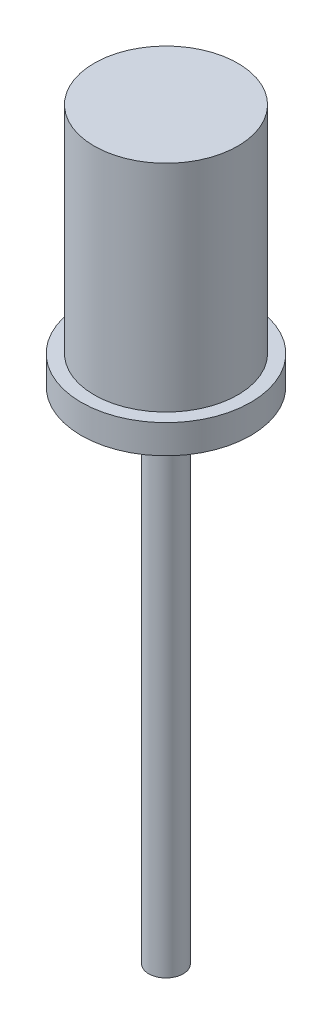
ISO-10303-21;
HEADER;
FILE_DESCRIPTION(('STEP AP214'),'2;1');
FILE_NAME('part.step','',(''),(''),'','','');
FILE_SCHEMA(('AUTOMOTIVE_DESIGN { 1 0 10303 214 1 1 1 1 }'));
ENDSEC;
DATA;
#1=APPLICATION_CONTEXT('core data for automotive mechanical design processes');
#2=APPLICATION_PROTOCOL_DEFINITION('international standard','automotive_design',2000,#1);
#3=PRODUCT_CONTEXT('',#1,'mechanical');
#4=PRODUCT('Part','Part','',(#3));
#5=PRODUCT_RELATED_PRODUCT_CATEGORY('part','',(#4));
#6=PRODUCT_DEFINITION_FORMATION('','',#4);
#7=PRODUCT_DEFINITION_CONTEXT('part definition',#1,'design');
#8=PRODUCT_DEFINITION('design','',#6,#7);
#9=PRODUCT_DEFINITION_SHAPE('','',#8);
#10=(LENGTH_UNIT() NAMED_UNIT(*) SI_UNIT(.MILLI.,.METRE.));
#11=(NAMED_UNIT(*) PLANE_ANGLE_UNIT() SI_UNIT($,.RADIAN.));
#12=(NAMED_UNIT(*) SI_UNIT($,.STERADIAN.) SOLID_ANGLE_UNIT());
#13=UNCERTAINTY_MEASURE_WITH_UNIT(LENGTH_MEASURE(1.E-05),#10,'distance_accuracy_value','');
#14=(GEOMETRIC_REPRESENTATION_CONTEXT(3) GLOBAL_UNCERTAINTY_ASSIGNED_CONTEXT((#13)) GLOBAL_UNIT_ASSIGNED_CONTEXT((#10,
#11,#12)) REPRESENTATION_CONTEXT('',''));
#15=CARTESIAN_POINT('',(0.,0.,0.));
#16=DIRECTION('',(0.,0.,1.));
#17=DIRECTION('',(1.,0.,0.));
#18=AXIS2_PLACEMENT_3D('',#15,#16,#17);
#19=CARTESIAN_POINT('',(0.,1.,0.));
#20=DIRECTION('',(0.,-1.,0.));
#21=DIRECTION('',(0.,0.,-1.));
#22=AXIS2_PLACEMENT_3D('',#19,#20,#21);
#23=CYLINDRICAL_SURFACE('',#22,2.95);
#24=CARTESIAN_POINT('',(0.,1.,0.));
#25=DIRECTION('',(0.,1.,0.));
#26=DIRECTION('',(0.,0.,1.));
#27=AXIS2_PLACEMENT_3D('',#24,#25,#26);
#28=CIRCLE('',#27,2.95);
#29=CARTESIAN_POINT('',(0.,1.,2.95));
#30=VERTEX_POINT('',#29);
#31=EDGE_CURVE('E51',#30,#30,#28,.T.);
#32=ORIENTED_EDGE('',*,*,#31,.F.);
#33=EDGE_LOOP('',(#32));
#34=FACE_BOUND('',#33,.T.);
#35=CARTESIAN_POINT('',(0.,0.,0.));
#36=DIRECTION('',(0.,1.,0.));
#37=DIRECTION('',(0.,0.,1.));
#38=AXIS2_PLACEMENT_3D('',#35,#36,#37);
#39=CIRCLE('',#38,2.95);
#40=CARTESIAN_POINT('',(0.,0.,2.95));
#41=VERTEX_POINT('',#40);
#42=EDGE_CURVE('E42',#41,#41,#39,.T.);
#43=ORIENTED_EDGE('',*,*,#42,.T.);
#44=EDGE_LOOP('',(#43));
#45=FACE_BOUND('',#44,.T.);
#46=ADVANCED_FACE('F39',(#34,#45),#23,.T.);
#47=CARTESIAN_POINT('',(0.,1.,0.));
#48=DIRECTION('',(0.,1.,0.));
#49=DIRECTION('',(0.,0.,1.));
#50=AXIS2_PLACEMENT_3D('',#47,#48,#49);
#51=PLANE('',#50);
#52=CARTESIAN_POINT('',(0.,1.,0.));
#53=DIRECTION('',(0.,1.,0.));
#54=DIRECTION('',(0.,0.,1.));
#55=AXIS2_PLACEMENT_3D('',#52,#53,#54);
#56=CIRCLE('',#55,2.5);
#57=CARTESIAN_POINT('',(0.,1.,2.5));
#58=VERTEX_POINT('',#57);
#59=EDGE_CURVE('E46',#58,#58,#56,.T.);
#60=ORIENTED_EDGE('',*,*,#59,.F.);
#61=EDGE_LOOP('',(#60));
#62=FACE_BOUND('',#61,.T.);
#63=ORIENTED_EDGE('',*,*,#31,.T.);
#64=EDGE_LOOP('',(#63));
#65=FACE_BOUND('',#64,.T.);
#66=ADVANCED_FACE('F68',(#62,#65),#51,.T.);
#67=CARTESIAN_POINT('',(0.,0.,0.));
#68=DIRECTION('',(0.,1.,0.));
#69=DIRECTION('',(0.,0.,1.));
#70=AXIS2_PLACEMENT_3D('',#67,#68,#69);
#71=PLANE('',#70);
#72=CARTESIAN_POINT('',(0.,0.,0.));
#73=DIRECTION('',(0.,-1.,0.));
#74=DIRECTION('',(0.,0.,-1.));
#75=AXIS2_PLACEMENT_3D('',#72,#73,#74);
#76=CIRCLE('',#75,0.6);
#77=CARTESIAN_POINT('',(0.,0.,-0.6));
#78=VERTEX_POINT('',#77);
#79=EDGE_CURVE('E10',#78,#78,#76,.T.);
#80=ORIENTED_EDGE('',*,*,#79,.F.);
#81=EDGE_LOOP('',(#80));
#82=FACE_BOUND('',#81,.T.);
#83=ORIENTED_EDGE('',*,*,#42,.F.);
#84=EDGE_LOOP('',(#83));
#85=FACE_BOUND('',#84,.T.);
#86=ADVANCED_FACE('F65',(#82,#85),#71,.F.);
#87=CARTESIAN_POINT('',(0.,8.5,0.));
#88=DIRECTION('',(0.,-1.,0.));
#89=DIRECTION('',(0.,0.,-1.));
#90=AXIS2_PLACEMENT_3D('',#87,#88,#89);
#91=CYLINDRICAL_SURFACE('',#90,2.5);
#92=CARTESIAN_POINT('',(0.,8.5,0.));
#93=DIRECTION('',(0.,1.,0.));
#94=DIRECTION('',(0.,0.,1.));
#95=AXIS2_PLACEMENT_3D('',#92,#93,#94);
#96=CIRCLE('',#95,2.5);
#97=CARTESIAN_POINT('',(0.,8.5,2.5));
#98=VERTEX_POINT('',#97);
#99=EDGE_CURVE('E56',#98,#98,#96,.T.);
#100=ORIENTED_EDGE('',*,*,#99,.F.);
#101=EDGE_LOOP('',(#100));
#102=FACE_BOUND('',#101,.T.);
#103=ORIENTED_EDGE('',*,*,#59,.T.);
#104=EDGE_LOOP('',(#103));
#105=FACE_BOUND('',#104,.T.);
#106=ADVANCED_FACE('F67',(#102,#105),#91,.T.);
#107=CARTESIAN_POINT('',(0.,8.5,0.));
#108=DIRECTION('',(0.,1.,0.));
#109=DIRECTION('',(0.,0.,1.));
#110=AXIS2_PLACEMENT_3D('',#107,#108,#109);
#111=PLANE('',#110);
#112=ORIENTED_EDGE('',*,*,#99,.T.);
#113=EDGE_LOOP('',(#112));
#114=FACE_BOUND('',#113,.T.);
#115=ADVANCED_FACE('F74',(#114),#111,.T.);
#116=CARTESIAN_POINT('',(0.,-17.4,0.));
#117=DIRECTION('',(0.,1.,0.));
#118=DIRECTION('',(0.,0.,1.));
#119=AXIS2_PLACEMENT_3D('',#116,#117,#118);
#120=CYLINDRICAL_SURFACE('',#119,0.6);
#121=CARTESIAN_POINT('',(0.,-17.4,0.));
#122=DIRECTION('',(0.,-1.,0.));
#123=DIRECTION('',(0.,0.,-1.));
#124=AXIS2_PLACEMENT_3D('',#121,#122,#123);
#125=CIRCLE('',#124,0.6);
#126=CARTESIAN_POINT('',(0.,-17.4,-0.6));
#127=VERTEX_POINT('',#126);
#128=EDGE_CURVE('E55',#127,#127,#125,.T.);
#129=ORIENTED_EDGE('',*,*,#128,.F.);
#130=EDGE_LOOP('',(#129));
#131=FACE_BOUND('',#130,.T.);
#132=ORIENTED_EDGE('',*,*,#79,.T.);
#133=EDGE_LOOP('',(#132));
#134=FACE_BOUND('',#133,.T.);
#135=ADVANCED_FACE('F104',(#131,#134),#120,.T.);
#136=CARTESIAN_POINT('',(0.,-17.4,0.));
#137=DIRECTION('',(0.,-1.,0.));
#138=DIRECTION('',(0.,0.,-1.));
#139=AXIS2_PLACEMENT_3D('',#136,#137,#138);
#140=PLANE('',#139);
#141=ORIENTED_EDGE('',*,*,#128,.T.);
#142=EDGE_LOOP('',(#141));
#143=FACE_BOUND('',#142,.T.);
#144=ADVANCED_FACE('F120',(#143),#140,.T.);
#145=CLOSED_SHELL('',(#46,#66,#86,#106,#115,#135,#144));
#146=MANIFOLD_SOLID_BREP('B2',#145);
#147=ADVANCED_BREP_SHAPE_REPRESENTATION('',(#18,#146),#14);
#148=SHAPE_DEFINITION_REPRESENTATION(#9,#147);
ENDSEC;
END-ISO-10303-21;
